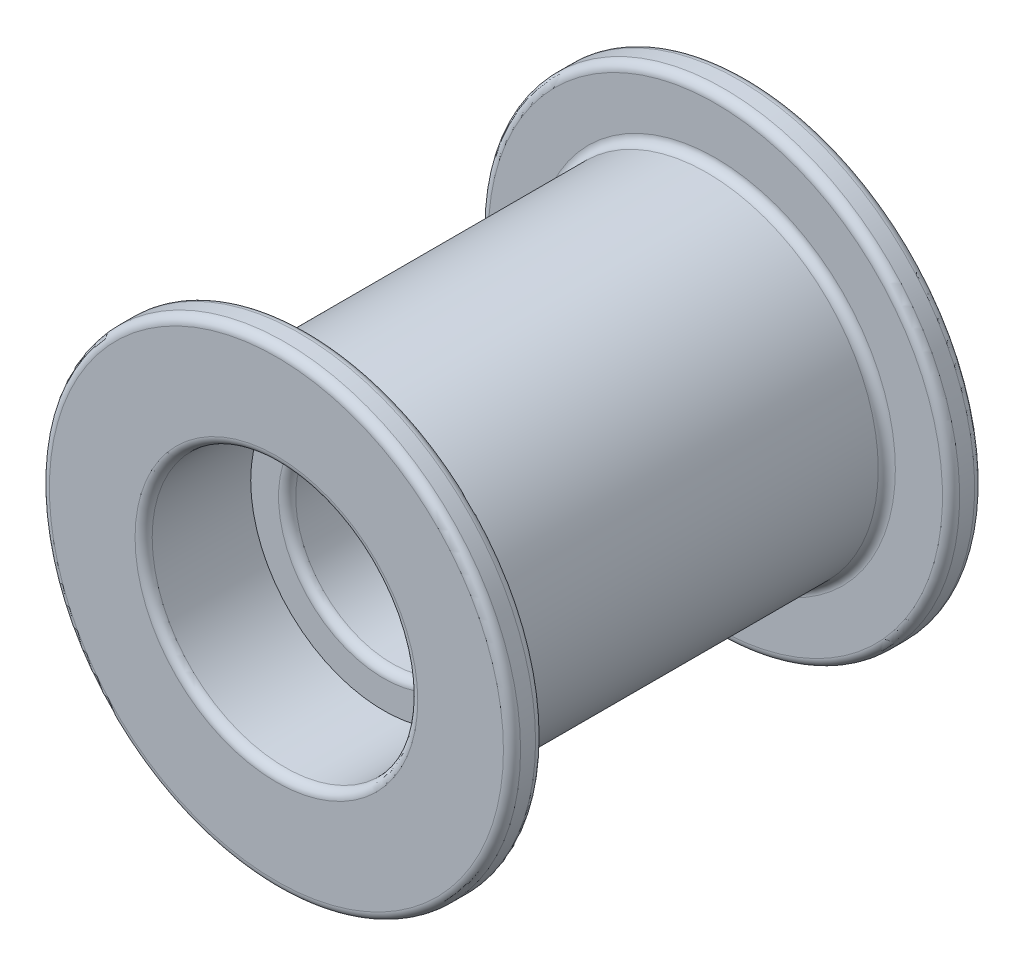
ISO-10303-21;
HEADER;
FILE_DESCRIPTION(('STEP AP214'),'2;1');
FILE_NAME('part.step','',(''),(''),'','','');
FILE_SCHEMA(('AUTOMOTIVE_DESIGN { 1 0 10303 214 1 1 1 1 }'));
ENDSEC;
DATA;
#1=APPLICATION_CONTEXT('core data for automotive mechanical design processes');
#2=APPLICATION_PROTOCOL_DEFINITION('international standard','automotive_design',2000,#1);
#3=PRODUCT_CONTEXT('',#1,'mechanical');
#4=PRODUCT('Part','Part','',(#3));
#5=PRODUCT_RELATED_PRODUCT_CATEGORY('part','',(#4));
#6=PRODUCT_DEFINITION_FORMATION('','',#4);
#7=PRODUCT_DEFINITION_CONTEXT('part definition',#1,'design');
#8=PRODUCT_DEFINITION('design','',#6,#7);
#9=PRODUCT_DEFINITION_SHAPE('','',#8);
#10=(LENGTH_UNIT() NAMED_UNIT(*) SI_UNIT(.MILLI.,.METRE.));
#11=(NAMED_UNIT(*) PLANE_ANGLE_UNIT() SI_UNIT($,.RADIAN.));
#12=(NAMED_UNIT(*) SI_UNIT($,.STERADIAN.) SOLID_ANGLE_UNIT());
#13=UNCERTAINTY_MEASURE_WITH_UNIT(LENGTH_MEASURE(1.E-05),#10,'distance_accuracy_value','');
#14=(GEOMETRIC_REPRESENTATION_CONTEXT(3) GLOBAL_UNCERTAINTY_ASSIGNED_CONTEXT((#13)) GLOBAL_UNIT_ASSIGNED_CONTEXT((#10,
#11,#12)) REPRESENTATION_CONTEXT('',''));
#15=CARTESIAN_POINT('',(0.,0.,0.));
#16=DIRECTION('',(0.,0.,1.));
#17=DIRECTION('',(1.,0.,0.));
#18=AXIS2_PLACEMENT_3D('',#15,#16,#17);
#19=CARTESIAN_POINT('',(17.0566896246943,83.,-11.5));
#20=DIRECTION('',(0.,0.,1.));
#21=DIRECTION('',(1.,0.,0.));
#22=AXIS2_PLACEMENT_3D('',#19,#20,#21);
#23=CYLINDRICAL_SURFACE('',#22,4.);
#24=CARTESIAN_POINT('',(17.0566896246943,83.,-10.3));
#25=DIRECTION('',(0.,0.,-1.));
#26=DIRECTION('',(-1.,0.,0.));
#27=AXIS2_PLACEMENT_3D('',#24,#25,#26);
#28=CIRCLE('',#27,4.);
#29=CARTESIAN_POINT('',(21.0566896246943,83.,-10.3));
#30=VERTEX_POINT('',#29);
#31=EDGE_CURVE('E44',#30,#30,#28,.F.);
#32=CARTESIAN_POINT('',(17.0566896246943,83.,-1.2));
#33=DIRECTION('',(0.,0.,1.));
#34=DIRECTION('',(1.,0.,0.));
#35=AXIS2_PLACEMENT_3D('',#32,#33,#34);
#36=CIRCLE('',#35,4.);
#37=CARTESIAN_POINT('',(21.0566896246943,83.,-1.2));
#38=VERTEX_POINT('',#37);
#39=EDGE_CURVE('E48',#38,#38,#36,.F.);
#40=CARTESIAN_POINT('',(21.0566896246943,83.,-10.3));
#41=CARTESIAN_POINT('',(21.0566896246943,83.,-10.2052083333333));
#42=CARTESIAN_POINT('',(21.0566896246943,83.,-10.1104166666667));
#43=CARTESIAN_POINT('',(21.0566896246943,83.,-9.92083333333333));
#44=CARTESIAN_POINT('',(21.0566896246943,83.,-9.82604166666667));
#45=CARTESIAN_POINT('',(21.0566896246943,83.,-9.63645833333333));
#46=CARTESIAN_POINT('',(21.0566896246943,83.,-9.54166666666667));
#47=CARTESIAN_POINT('',(21.0566896246943,83.,-9.35208333333333));
#48=CARTESIAN_POINT('',(21.0566896246943,83.,-9.25729166666667));
#49=CARTESIAN_POINT('',(21.0566896246943,83.,-9.06770833333333));
#50=CARTESIAN_POINT('',(21.0566896246943,83.,-8.97291666666666));
#51=CARTESIAN_POINT('',(21.0566896246943,83.,-8.78333333333333));
#52=CARTESIAN_POINT('',(21.0566896246943,83.,-8.68854166666667));
#53=CARTESIAN_POINT('',(21.0566896246943,83.,-8.49895833333333));
#54=CARTESIAN_POINT('',(21.0566896246943,83.,-8.40416666666667));
#55=CARTESIAN_POINT('',(21.0566896246943,83.,-8.21458333333333));
#56=CARTESIAN_POINT('',(21.0566896246943,83.,-8.11979166666667));
#57=CARTESIAN_POINT('',(21.0566896246943,83.,-7.93020833333333));
#58=CARTESIAN_POINT('',(21.0566896246943,83.,-7.83541666666667));
#59=CARTESIAN_POINT('',(21.0566896246943,83.,-7.64583333333333));
#60=CARTESIAN_POINT('',(21.0566896246943,83.,-7.55104166666667));
#61=CARTESIAN_POINT('',(21.0566896246943,83.,-7.36145833333333));
#62=CARTESIAN_POINT('',(21.0566896246943,83.,-7.26666666666667));
#63=CARTESIAN_POINT('',(21.0566896246943,83.,-7.07708333333333));
#64=CARTESIAN_POINT('',(21.0566896246943,83.,-6.98229166666667));
#65=CARTESIAN_POINT('',(21.0566896246943,83.,-6.79270833333333));
#66=CARTESIAN_POINT('',(21.0566896246943,83.,-6.69791666666667));
#67=CARTESIAN_POINT('',(21.0566896246943,83.,-6.50833333333333));
#68=CARTESIAN_POINT('',(21.0566896246943,83.,-6.41354166666667));
#69=CARTESIAN_POINT('',(21.0566896246943,83.,-6.22395833333333));
#70=CARTESIAN_POINT('',(21.0566896246943,83.,-6.12916666666667));
#71=CARTESIAN_POINT('',(21.0566896246943,83.,-5.93958333333333));
#72=CARTESIAN_POINT('',(21.0566896246943,83.,-5.84479166666667));
#73=CARTESIAN_POINT('',(21.0566896246943,83.,-5.65520833333333));
#74=CARTESIAN_POINT('',(21.0566896246943,83.,-5.56041666666667));
#75=CARTESIAN_POINT('',(21.0566896246943,83.,-5.37083333333333));
#76=CARTESIAN_POINT('',(21.0566896246943,83.,-5.27604166666667));
#77=CARTESIAN_POINT('',(21.0566896246943,83.,-5.08645833333333));
#78=CARTESIAN_POINT('',(21.0566896246943,83.,-4.99166666666667));
#79=CARTESIAN_POINT('',(21.0566896246943,83.,-4.80208333333333));
#80=CARTESIAN_POINT('',(21.0566896246943,83.,-4.70729166666667));
#81=CARTESIAN_POINT('',(21.0566896246943,83.,-4.51770833333333));
#82=CARTESIAN_POINT('',(21.0566896246943,83.,-4.42291666666667));
#83=CARTESIAN_POINT('',(21.0566896246943,83.,-4.23333333333333));
#84=CARTESIAN_POINT('',(21.0566896246943,83.,-4.13854166666667));
#85=CARTESIAN_POINT('',(21.0566896246943,83.,-3.94895833333333));
#86=CARTESIAN_POINT('',(21.0566896246943,83.,-3.85416666666667));
#87=CARTESIAN_POINT('',(21.0566896246943,83.,-3.66458333333333));
#88=CARTESIAN_POINT('',(21.0566896246943,83.,-3.56979166666667));
#89=CARTESIAN_POINT('',(21.0566896246943,83.,-3.38020833333333));
#90=CARTESIAN_POINT('',(21.0566896246943,83.,-3.28541666666667));
#91=CARTESIAN_POINT('',(21.0566896246943,83.,-3.09583333333333));
#92=CARTESIAN_POINT('',(21.0566896246943,83.,-3.00104166666667));
#93=CARTESIAN_POINT('',(21.0566896246943,83.,-2.81145833333333));
#94=CARTESIAN_POINT('',(21.0566896246943,83.,-2.71666666666667));
#95=CARTESIAN_POINT('',(21.0566896246943,83.,-2.52708333333333));
#96=CARTESIAN_POINT('',(21.0566896246943,83.,-2.43229166666667));
#97=CARTESIAN_POINT('',(21.0566896246943,83.,-2.24270833333333));
#98=CARTESIAN_POINT('',(21.0566896246943,83.,-2.14791666666667));
#99=CARTESIAN_POINT('',(21.0566896246943,83.,-1.95833333333333));
#100=CARTESIAN_POINT('',(21.0566896246943,83.,-1.86354166666667));
#101=CARTESIAN_POINT('',(21.0566896246943,83.,-1.67395833333333));
#102=CARTESIAN_POINT('',(21.0566896246943,83.,-1.57916666666667));
#103=CARTESIAN_POINT('',(21.0566896246943,83.,-1.38958333333333));
#104=CARTESIAN_POINT('',(21.0566896246943,83.,-1.29479166666667));
#105=CARTESIAN_POINT('',(21.0566896246943,83.,-1.2));
#106=B_SPLINE_CURVE_WITH_KNOTS('',3,(#40,#41,#42,#43,#44,#45,#46,#47,#48,#49,#50,#51,#52,#53,
#54,#55,#56,#57,#58,#59,#60,#61,#62,#63,#64,#65,#66,#67,#68,#69,#70,#71,#72,#73,#74,#75,#76,#77,
#78,#79,#80,#81,#82,#83,#84,#85,#86,#87,#88,#89,#90,#91,#92,#93,#94,#95,#96,#97,#98,#99,#100,
#101,#102,#103,#104,#105),.UNSPECIFIED.,.F.,.F.,(4,2,2,2,2,2,2,2,2,2,2,2,2,2,2,2,2,2,2,2,2,2,2,
2,2,2,2,2,2,2,2,2,4),(0.,0.284375,0.56875,0.853125,1.1375,1.421875,1.70625,1.990625,2.275,
2.559375,2.84375,3.128125,3.4125,3.696875,3.98125,4.265625,4.55,4.834375,5.11875,5.403125,
5.6875,5.971875,6.25625,6.540625,6.825,7.109375,7.39375,7.678125,7.9625,8.246875,8.53125,
8.815625,9.1),.UNSPECIFIED.);
#107=EDGE_CURVE('BSEAM33',#30,#38,#106,.T.);
#108=ORIENTED_EDGE('',*,*,#31,.T.);
#109=ORIENTED_EDGE('',*,*,#39,.T.);
#110=ORIENTED_EDGE('',*,*,#107,.T.);
#111=ORIENTED_EDGE('',*,*,#107,.F.);
#112=EDGE_LOOP('',(#108,#110,#109,#111));
#113=FACE_BOUND('',#112,.T.);
#114=ADVANCED_FACE('F33',(#113),#23,.T.);
#115=CARTESIAN_POINT('',(17.0566896246943,83.,-11.25));
#116=DIRECTION('',(0.,0.,1.));
#117=DIRECTION('',(1.,0.,0.));
#118=AXIS2_PLACEMENT_3D('',#115,#116,#117);
#119=CYLINDRICAL_SURFACE('',#118,2.25);
#120=CARTESIAN_POINT('',(17.0566896246943,83.,-8.55));
#121=DIRECTION('',(0.,0.,-1.));
#122=DIRECTION('',(-1.,0.,0.));
#123=AXIS2_PLACEMENT_3D('',#120,#121,#122);
#124=CIRCLE('',#123,2.25);
#125=CARTESIAN_POINT('',(14.8066896246943,83.,-8.55));
#126=VERTEX_POINT('',#125);
#127=EDGE_CURVE('E62',#126,#126,#124,.T.);
#128=ORIENTED_EDGE('',*,*,#127,.T.);
#129=EDGE_LOOP('',(#128));
#130=FACE_BOUND('',#129,.T.);
#131=CARTESIAN_POINT('',(17.0566896246943,83.,-2.95));
#132=DIRECTION('',(0.,0.,1.));
#133=DIRECTION('',(1.,0.,0.));
#134=AXIS2_PLACEMENT_3D('',#131,#132,#133);
#135=CIRCLE('',#134,2.25);
#136=CARTESIAN_POINT('',(19.3066896246943,83.,-2.95));
#137=VERTEX_POINT('',#136);
#138=EDGE_CURVE('E65',#137,#137,#135,.T.);
#139=ORIENTED_EDGE('',*,*,#138,.T.);
#140=EDGE_LOOP('',(#139));
#141=FACE_BOUND('',#140,.T.);
#142=ADVANCED_FACE('F126',(#130,#141),#119,.F.);
#143=CARTESIAN_POINT('',(0.,0.,-0.25));
#144=DIRECTION('',(0.,0.,1.));
#145=DIRECTION('',(1.,0.,0.));
#146=AXIS2_PLACEMENT_3D('',#143,#144,#145);
#147=PLANE('',#146);
#148=CARTESIAN_POINT('',(17.0566896246943,83.,-0.25));
#149=DIRECTION('',(0.,0.,1.));
#150=DIRECTION('',(1.,0.,0.));
#151=AXIS2_PLACEMENT_3D('',#148,#149,#150);
#152=CIRCLE('',#151,5.3);
#153=CARTESIAN_POINT('',(22.3566896246943,83.,-0.25));
#154=VERTEX_POINT('',#153);
#155=EDGE_CURVE('E71',#154,#154,#152,.T.);
#156=ORIENTED_EDGE('',*,*,#155,.T.);
#157=EDGE_LOOP('',(#156));
#158=FACE_BOUND('',#157,.T.);
#159=CARTESIAN_POINT('',(17.0566896246943,83.,-0.25));
#160=DIRECTION('',(0.,0.,1.));
#161=DIRECTION('',(1.,0.,0.));
#162=AXIS2_PLACEMENT_3D('',#159,#160,#161);
#163=CIRCLE('',#162,3.3);
#164=CARTESIAN_POINT('',(20.3566896246943,83.,-0.25));
#165=VERTEX_POINT('',#164);
#166=EDGE_CURVE('E74',#165,#165,#163,.F.);
#167=ORIENTED_EDGE('',*,*,#166,.T.);
#168=EDGE_LOOP('',(#167));
#169=FACE_BOUND('',#168,.T.);
#170=ADVANCED_FACE('F132',(#158,#169),#147,.T.);
#171=CARTESIAN_POINT('',(17.0566896246943,83.,-11.25));
#172=DIRECTION('',(0.,0.,-1.));
#173=DIRECTION('',(-1.,0.,0.));
#174=AXIS2_PLACEMENT_3D('',#171,#172,#173);
#175=PLANE('',#174);
#176=CARTESIAN_POINT('',(17.0566896246943,83.,-11.25));
#177=DIRECTION('',(0.,0.,-1.));
#178=DIRECTION('',(-1.,0.,0.));
#179=AXIS2_PLACEMENT_3D('',#176,#177,#178);
#180=CIRCLE('',#179,5.3);
#181=CARTESIAN_POINT('',(11.7566896246943,83.,-11.25));
#182=VERTEX_POINT('',#181);
#183=EDGE_CURVE('E86',#182,#182,#180,.T.);
#184=ORIENTED_EDGE('',*,*,#183,.T.);
#185=EDGE_LOOP('',(#184));
#186=FACE_BOUND('',#185,.T.);
#187=CARTESIAN_POINT('',(17.0566896246943,83.,-11.25));
#188=DIRECTION('',(0.,0.,-1.));
#189=DIRECTION('',(-1.,0.,0.));
#190=AXIS2_PLACEMENT_3D('',#187,#188,#189);
#191=CIRCLE('',#190,3.3);
#192=CARTESIAN_POINT('',(13.7566896246943,83.,-11.25));
#193=VERTEX_POINT('',#192);
#194=EDGE_CURVE('E89',#193,#193,#191,.F.);
#195=ORIENTED_EDGE('',*,*,#194,.T.);
#196=EDGE_LOOP('',(#195));
#197=FACE_BOUND('',#196,.T.);
#198=ADVANCED_FACE('F304',(#186,#197),#175,.T.);
#199=CARTESIAN_POINT('',(17.0566896246943,83.,-2.75));
#200=DIRECTION('',(0.,0.,1.));
#201=DIRECTION('',(1.,0.,0.));
#202=AXIS2_PLACEMENT_3D('',#199,#200,#201);
#203=CYLINDRICAL_SURFACE('',#202,3.1);
#204=CARTESIAN_POINT('',(17.0566896246943,83.,-0.45));
#205=DIRECTION('',(0.,0.,1.));
#206=DIRECTION('',(1.,0.,0.));
#207=AXIS2_PLACEMENT_3D('',#204,#205,#206);
#208=CIRCLE('',#207,3.1);
#209=CARTESIAN_POINT('',(20.1566896246943,83.,-0.45));
#210=VERTEX_POINT('',#209);
#211=EDGE_CURVE('E53',#210,#210,#208,.T.);
#212=ORIENTED_EDGE('',*,*,#211,.T.);
#213=EDGE_LOOP('',(#212));
#214=FACE_BOUND('',#213,.T.);
#215=CARTESIAN_POINT('',(17.0566896246943,83.,-2.75));
#216=DIRECTION('',(0.,0.,1.));
#217=DIRECTION('',(1.,0.,0.));
#218=AXIS2_PLACEMENT_3D('',#215,#216,#217);
#219=CIRCLE('',#218,3.1);
#220=CARTESIAN_POINT('',(20.1566896246943,83.,-2.75));
#221=VERTEX_POINT('',#220);
#222=EDGE_CURVE('E101',#221,#221,#219,.T.);
#223=ORIENTED_EDGE('',*,*,#222,.F.);
#224=EDGE_LOOP('',(#223));
#225=FACE_BOUND('',#224,.T.);
#226=ADVANCED_FACE('F294',(#214,#225),#203,.F.);
#227=CARTESIAN_POINT('',(0.,0.,-2.75));
#228=DIRECTION('',(0.,0.,1.));
#229=DIRECTION('',(1.,0.,0.));
#230=AXIS2_PLACEMENT_3D('',#227,#228,#229);
#231=PLANE('',#230);
#232=CARTESIAN_POINT('',(17.0566896246943,83.,-2.75));
#233=DIRECTION('',(0.,0.,1.));
#234=DIRECTION('',(1.,0.,0.));
#235=AXIS2_PLACEMENT_3D('',#232,#233,#234);
#236=CIRCLE('',#235,2.45);
#237=CARTESIAN_POINT('',(19.5066896246943,83.,-2.75));
#238=VERTEX_POINT('',#237);
#239=EDGE_CURVE('E56',#238,#238,#236,.F.);
#240=ORIENTED_EDGE('',*,*,#239,.T.);
#241=EDGE_LOOP('',(#240));
#242=FACE_BOUND('',#241,.T.);
#243=ORIENTED_EDGE('',*,*,#222,.T.);
#244=EDGE_LOOP('',(#243));
#245=FACE_BOUND('',#244,.T.);
#246=ADVANCED_FACE('F283',(#242,#245),#231,.T.);
#247=CARTESIAN_POINT('',(17.0566896246943,83.,-1.));
#248=DIRECTION('',(0.,0.,1.));
#249=DIRECTION('',(1.,0.,0.));
#250=AXIS2_PLACEMENT_3D('',#247,#248,#249);
#251=CYLINDRICAL_SURFACE('',#250,5.5);
#252=CARTESIAN_POINT('',(17.0566896246943,83.,-0.8));
#253=DIRECTION('',(0.,0.,1.));
#254=DIRECTION('',(1.,0.,0.));
#255=AXIS2_PLACEMENT_3D('',#252,#253,#254);
#256=CIRCLE('',#255,5.5);
#257=CARTESIAN_POINT('',(22.5566896246943,83.,-0.8));
#258=VERTEX_POINT('',#257);
#259=EDGE_CURVE('E80',#258,#258,#256,.T.);
#260=ORIENTED_EDGE('',*,*,#259,.T.);
#261=EDGE_LOOP('',(#260));
#262=FACE_BOUND('',#261,.T.);
#263=CARTESIAN_POINT('',(17.0566896246943,83.,-0.45));
#264=DIRECTION('',(0.,0.,1.));
#265=DIRECTION('',(1.,0.,0.));
#266=AXIS2_PLACEMENT_3D('',#263,#264,#265);
#267=CIRCLE('',#266,5.5);
#268=CARTESIAN_POINT('',(22.5566896246943,83.,-0.45));
#269=VERTEX_POINT('',#268);
#270=EDGE_CURVE('E83',#269,#269,#267,.F.);
#271=ORIENTED_EDGE('',*,*,#270,.T.);
#272=EDGE_LOOP('',(#271));
#273=FACE_BOUND('',#272,.T.);
#274=ADVANCED_FACE('F122',(#262,#273),#251,.T.);
#275=CARTESIAN_POINT('',(17.0566896246943,83.,-1.));
#276=DIRECTION('',(0.,0.,1.));
#277=DIRECTION('',(1.,0.,0.));
#278=AXIS2_PLACEMENT_3D('',#275,#276,#277);
#279=PLANE('',#278);
#280=CARTESIAN_POINT('',(17.0566896246943,83.,-1.));
#281=DIRECTION('',(0.,0.,1.));
#282=DIRECTION('',(1.,0.,0.));
#283=AXIS2_PLACEMENT_3D('',#280,#281,#282);
#284=CIRCLE('',#283,4.2);
#285=CARTESIAN_POINT('',(21.2566896246943,83.,-1.));
#286=VERTEX_POINT('',#285);
#287=EDGE_CURVE('E10',#286,#286,#284,.T.);
#288=ORIENTED_EDGE('',*,*,#287,.T.);
#289=EDGE_LOOP('',(#288));
#290=FACE_BOUND('',#289,.T.);
#291=CARTESIAN_POINT('',(17.0566896246943,83.,-1.));
#292=DIRECTION('',(0.,0.,1.));
#293=DIRECTION('',(1.,0.,0.));
#294=AXIS2_PLACEMENT_3D('',#291,#292,#293);
#295=CIRCLE('',#294,5.3);
#296=CARTESIAN_POINT('',(22.3566896246943,83.,-1.));
#297=VERTEX_POINT('',#296);
#298=EDGE_CURVE('E77',#297,#297,#295,.F.);
#299=ORIENTED_EDGE('',*,*,#298,.T.);
#300=EDGE_LOOP('',(#299));
#301=FACE_BOUND('',#300,.T.);
#302=ADVANCED_FACE('F112',(#290,#301),#279,.F.);
#303=CARTESIAN_POINT('',(0.,0.,-8.75));
#304=DIRECTION('',(0.,0.,-1.));
#305=DIRECTION('',(1.,0.,0.));
#306=AXIS2_PLACEMENT_3D('',#303,#304,#305);
#307=PLANE('',#306);
#308=CARTESIAN_POINT('',(17.0566896246943,83.,-8.75));
#309=DIRECTION('',(0.,0.,-1.));
#310=DIRECTION('',(-1.,0.,0.));
#311=AXIS2_PLACEMENT_3D('',#308,#309,#310);
#312=CIRCLE('',#311,2.45);
#313=CARTESIAN_POINT('',(14.6066896246943,83.,-8.75));
#314=VERTEX_POINT('',#313);
#315=EDGE_CURVE('E68',#314,#314,#312,.F.);
#316=ORIENTED_EDGE('',*,*,#315,.T.);
#317=EDGE_LOOP('',(#316));
#318=FACE_BOUND('',#317,.T.);
#319=CARTESIAN_POINT('',(17.0566896246943,83.,-8.75));
#320=DIRECTION('',(0.,0.,1.));
#321=DIRECTION('',(1.,0.,0.));
#322=AXIS2_PLACEMENT_3D('',#319,#320,#321);
#323=CIRCLE('',#322,3.1);
#324=CARTESIAN_POINT('',(20.1566896246943,83.,-8.75));
#325=VERTEX_POINT('',#324);
#326=EDGE_CURVE('E104',#325,#325,#323,.T.);
#327=ORIENTED_EDGE('',*,*,#326,.F.);
#328=EDGE_LOOP('',(#327));
#329=FACE_BOUND('',#328,.T.);
#330=ADVANCED_FACE('F110',(#318,#329),#307,.T.);
#331=CARTESIAN_POINT('',(17.0566896246943,83.,-8.75));
#332=DIRECTION('',(0.,0.,-1.));
#333=DIRECTION('',(-1.,0.,0.));
#334=AXIS2_PLACEMENT_3D('',#331,#332,#333);
#335=CYLINDRICAL_SURFACE('',#334,3.1);
#336=CARTESIAN_POINT('',(17.0566896246943,83.,-11.05));
#337=DIRECTION('',(0.,0.,-1.));
#338=DIRECTION('',(-1.,0.,0.));
#339=AXIS2_PLACEMENT_3D('',#336,#337,#338);
#340=CIRCLE('',#339,3.1);
#341=CARTESIAN_POINT('',(13.9566896246943,83.,-11.05));
#342=VERTEX_POINT('',#341);
#343=EDGE_CURVE('E59',#342,#342,#340,.T.);
#344=ORIENTED_EDGE('',*,*,#343,.T.);
#345=EDGE_LOOP('',(#344));
#346=FACE_BOUND('',#345,.T.);
#347=ORIENTED_EDGE('',*,*,#326,.T.);
#348=EDGE_LOOP('',(#347));
#349=FACE_BOUND('',#348,.T.);
#350=ADVANCED_FACE('F108',(#346,#349),#335,.F.);
#351=CARTESIAN_POINT('',(17.0566896246943,83.,-10.5));
#352=DIRECTION('',(0.,0.,-1.));
#353=DIRECTION('',(1.,0.,0.));
#354=AXIS2_PLACEMENT_3D('',#351,#352,#353);
#355=PLANE('',#354);
#356=CARTESIAN_POINT('',(17.0566896246943,83.,-10.5));
#357=DIRECTION('',(0.,0.,-1.));
#358=DIRECTION('',(-1.,0.,0.));
#359=AXIS2_PLACEMENT_3D('',#356,#357,#358);
#360=CIRCLE('',#359,4.2);
#361=CARTESIAN_POINT('',(12.8566896246943,83.,-10.5));
#362=VERTEX_POINT('',#361);
#363=EDGE_CURVE('E40',#362,#362,#360,.T.);
#364=ORIENTED_EDGE('',*,*,#363,.T.);
#365=EDGE_LOOP('',(#364));
#366=FACE_BOUND('',#365,.T.);
#367=CARTESIAN_POINT('',(17.0566896246943,83.,-10.5));
#368=DIRECTION('',(0.,0.,-1.));
#369=DIRECTION('',(-1.,0.,0.));
#370=AXIS2_PLACEMENT_3D('',#367,#368,#369);
#371=CIRCLE('',#370,5.3);
#372=CARTESIAN_POINT('',(11.7566896246943,83.,-10.5));
#373=VERTEX_POINT('',#372);
#374=EDGE_CURVE('E98',#373,#373,#371,.F.);
#375=ORIENTED_EDGE('',*,*,#374,.T.);
#376=EDGE_LOOP('',(#375));
#377=FACE_BOUND('',#376,.T.);
#378=ADVANCED_FACE('F119',(#366,#377),#355,.F.);
#379=CARTESIAN_POINT('',(17.0566896246943,83.,-10.5));
#380=DIRECTION('',(0.,0.,-1.));
#381=DIRECTION('',(-1.,0.,0.));
#382=AXIS2_PLACEMENT_3D('',#379,#380,#381);
#383=CYLINDRICAL_SURFACE('',#382,5.5);
#384=CARTESIAN_POINT('',(17.0566896246943,83.,-10.7));
#385=DIRECTION('',(0.,0.,-1.));
#386=DIRECTION('',(-1.,0.,0.));
#387=AXIS2_PLACEMENT_3D('',#384,#385,#386);
#388=CIRCLE('',#387,5.5);
#389=CARTESIAN_POINT('',(11.5566896246943,83.,-10.7));
#390=VERTEX_POINT('',#389);
#391=EDGE_CURVE('E92',#390,#390,#388,.T.);
#392=ORIENTED_EDGE('',*,*,#391,.T.);
#393=EDGE_LOOP('',(#392));
#394=FACE_BOUND('',#393,.T.);
#395=CARTESIAN_POINT('',(17.0566896246943,83.,-11.05));
#396=DIRECTION('',(0.,0.,-1.));
#397=DIRECTION('',(-1.,0.,0.));
#398=AXIS2_PLACEMENT_3D('',#395,#396,#397);
#399=CIRCLE('',#398,5.5);
#400=CARTESIAN_POINT('',(11.5566896246943,83.,-11.05));
#401=VERTEX_POINT('',#400);
#402=EDGE_CURVE('E95',#401,#401,#399,.F.);
#403=ORIENTED_EDGE('',*,*,#402,.T.);
#404=EDGE_LOOP('',(#403));
#405=FACE_BOUND('',#404,.T.);
#406=ADVANCED_FACE('F143',(#394,#405),#383,.T.);
#407=CARTESIAN_POINT('',(17.0566896246943,83.,-10.7));
#408=DIRECTION('',(0.,0.,-1.));
#409=DIRECTION('',(-1.,0.,0.));
#410=AXIS2_PLACEMENT_3D('',#407,#408,#409);
#411=TOROIDAL_SURFACE('',#410,5.3,0.2);
#412=ORIENTED_EDGE('',*,*,#391,.F.);
#413=EDGE_LOOP('',(#412));
#414=FACE_BOUND('',#413,.T.);
#415=ORIENTED_EDGE('',*,*,#374,.F.);
#416=EDGE_LOOP('',(#415));
#417=FACE_BOUND('',#416,.T.);
#418=ADVANCED_FACE('F139',(#414,#417),#411,.T.);
#419=CARTESIAN_POINT('',(17.0566896246943,83.,-11.05));
#420=DIRECTION('',(0.,0.,-1.));
#421=DIRECTION('',(-1.,0.,0.));
#422=AXIS2_PLACEMENT_3D('',#419,#420,#421);
#423=TOROIDAL_SURFACE('',#422,5.3,0.2);
#424=ORIENTED_EDGE('',*,*,#183,.F.);
#425=EDGE_LOOP('',(#424));
#426=FACE_BOUND('',#425,.T.);
#427=ORIENTED_EDGE('',*,*,#402,.F.);
#428=EDGE_LOOP('',(#427));
#429=FACE_BOUND('',#428,.T.);
#430=ADVANCED_FACE('F142',(#426,#429),#423,.T.);
#431=CARTESIAN_POINT('',(17.0566896246943,83.,-0.8));
#432=DIRECTION('',(0.,0.,1.));
#433=DIRECTION('',(1.,0.,0.));
#434=AXIS2_PLACEMENT_3D('',#431,#432,#433);
#435=TOROIDAL_SURFACE('',#434,5.3,0.2);
#436=ORIENTED_EDGE('',*,*,#298,.F.);
#437=EDGE_LOOP('',(#436));
#438=FACE_BOUND('',#437,.T.);
#439=ORIENTED_EDGE('',*,*,#259,.F.);
#440=EDGE_LOOP('',(#439));
#441=FACE_BOUND('',#440,.T.);
#442=ADVANCED_FACE('F147',(#438,#441),#435,.T.);
#443=CARTESIAN_POINT('',(17.0566896246943,83.,-0.45));
#444=DIRECTION('',(0.,0.,1.));
#445=DIRECTION('',(1.,0.,0.));
#446=AXIS2_PLACEMENT_3D('',#443,#444,#445);
#447=TOROIDAL_SURFACE('',#446,5.3,0.2);
#448=ORIENTED_EDGE('',*,*,#270,.F.);
#449=EDGE_LOOP('',(#448));
#450=FACE_BOUND('',#449,.T.);
#451=ORIENTED_EDGE('',*,*,#155,.F.);
#452=EDGE_LOOP('',(#451));
#453=FACE_BOUND('',#452,.T.);
#454=ADVANCED_FACE('F151',(#450,#453),#447,.T.);
#455=CARTESIAN_POINT('',(17.0566896246943,83.,-8.55));
#456=DIRECTION('',(0.,0.,-1.));
#457=DIRECTION('',(-1.,0.,0.));
#458=AXIS2_PLACEMENT_3D('',#455,#456,#457);
#459=TOROIDAL_SURFACE('',#458,2.45,0.2);
#460=ORIENTED_EDGE('',*,*,#127,.F.);
#461=EDGE_LOOP('',(#460));
#462=FACE_BOUND('',#461,.T.);
#463=ORIENTED_EDGE('',*,*,#315,.F.);
#464=EDGE_LOOP('',(#463));
#465=FACE_BOUND('',#464,.T.);
#466=ADVANCED_FACE('F155',(#462,#465),#459,.T.);
#467=CARTESIAN_POINT('',(17.0566896246943,83.,-11.05));
#468=DIRECTION('',(0.,0.,-1.));
#469=DIRECTION('',(-1.,0.,0.));
#470=AXIS2_PLACEMENT_3D('',#467,#468,#469);
#471=TOROIDAL_SURFACE('',#470,3.3,0.2);
#472=ORIENTED_EDGE('',*,*,#343,.F.);
#473=EDGE_LOOP('',(#472));
#474=FACE_BOUND('',#473,.T.);
#475=ORIENTED_EDGE('',*,*,#194,.F.);
#476=EDGE_LOOP('',(#475));
#477=FACE_BOUND('',#476,.T.);
#478=ADVANCED_FACE('F159',(#474,#477),#471,.T.);
#479=CARTESIAN_POINT('',(17.0566896246943,83.,-2.95));
#480=DIRECTION('',(0.,0.,1.));
#481=DIRECTION('',(1.,0.,0.));
#482=AXIS2_PLACEMENT_3D('',#479,#480,#481);
#483=TOROIDAL_SURFACE('',#482,2.45,0.2);
#484=ORIENTED_EDGE('',*,*,#239,.F.);
#485=EDGE_LOOP('',(#484));
#486=FACE_BOUND('',#485,.T.);
#487=ORIENTED_EDGE('',*,*,#138,.F.);
#488=EDGE_LOOP('',(#487));
#489=FACE_BOUND('',#488,.T.);
#490=ADVANCED_FACE('F163',(#486,#489),#483,.T.);
#491=CARTESIAN_POINT('',(17.0566896246943,83.,-0.45));
#492=DIRECTION('',(0.,0.,1.));
#493=DIRECTION('',(1.,0.,0.));
#494=AXIS2_PLACEMENT_3D('',#491,#492,#493);
#495=TOROIDAL_SURFACE('',#494,3.3,0.2);
#496=ORIENTED_EDGE('',*,*,#166,.F.);
#497=EDGE_LOOP('',(#496));
#498=FACE_BOUND('',#497,.T.);
#499=ORIENTED_EDGE('',*,*,#211,.F.);
#500=EDGE_LOOP('',(#499));
#501=FACE_BOUND('',#500,.T.);
#502=ADVANCED_FACE('F167',(#498,#501),#495,.T.);
#503=CARTESIAN_POINT('',(17.0566896246943,83.,-10.3));
#504=DIRECTION('',(0.,0.,-1.));
#505=DIRECTION('',(-1.,0.,0.));
#506=AXIS2_PLACEMENT_3D('',#503,#504,#505);
#507=TOROIDAL_SURFACE('',#506,4.2,0.2);
#508=ORIENTED_EDGE('',*,*,#363,.F.);
#509=EDGE_LOOP('',(#508));
#510=FACE_BOUND('',#509,.T.);
#511=ORIENTED_EDGE('',*,*,#31,.F.);
#512=EDGE_LOOP('',(#511));
#513=FACE_BOUND('',#512,.T.);
#514=ADVANCED_FACE('F170',(#510,#513),#507,.F.);
#515=CARTESIAN_POINT('',(17.0566896246943,83.,-1.2));
#516=DIRECTION('',(0.,0.,1.));
#517=DIRECTION('',(1.,0.,0.));
#518=AXIS2_PLACEMENT_3D('',#515,#516,#517);
#519=TOROIDAL_SURFACE('',#518,4.2,0.2);
#520=ORIENTED_EDGE('',*,*,#39,.F.);
#521=EDGE_LOOP('',(#520));
#522=FACE_BOUND('',#521,.T.);
#523=ORIENTED_EDGE('',*,*,#287,.F.);
#524=EDGE_LOOP('',(#523));
#525=FACE_BOUND('',#524,.T.);
#526=ADVANCED_FACE('F35',(#522,#525),#519,.F.);
#527=CLOSED_SHELL('',(#114,#142,#170,#198,#226,#246,#274,#302,#330,#350,#378,#406,#418,#430,
#442,#454,#466,#478,#490,#502,#514,#526));
#528=MANIFOLD_SOLID_BREP('B2',#527);
#529=ADVANCED_BREP_SHAPE_REPRESENTATION('',(#18,#528),#14);
#530=SHAPE_DEFINITION_REPRESENTATION(#9,#529);
ENDSEC;
END-ISO-10303-21;
